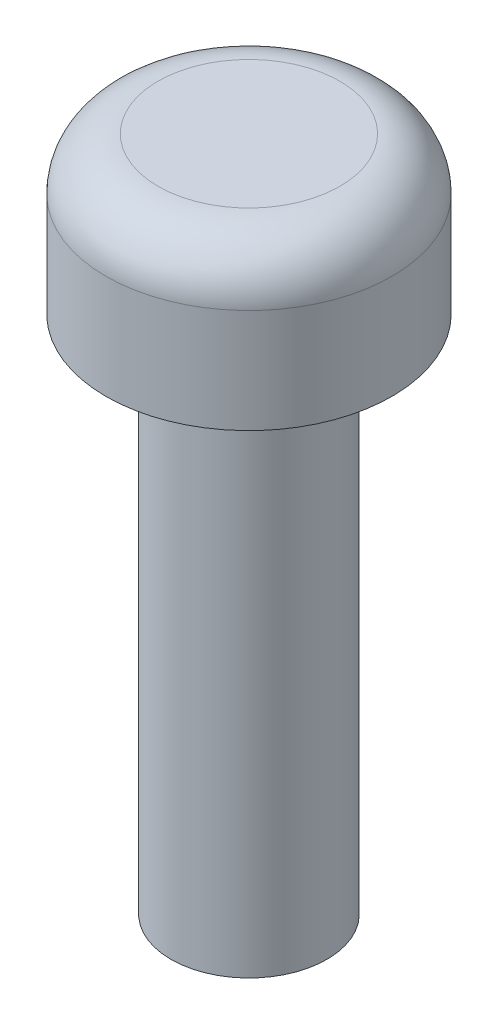
ISO-10303-21;
HEADER;
FILE_DESCRIPTION(('STEP AP214'),'2;1');
FILE_NAME('part.step','',(''),(''),'','','');
FILE_SCHEMA(('AUTOMOTIVE_DESIGN { 1 0 10303 214 1 1 1 1 }'));
ENDSEC;
DATA;
#1=APPLICATION_CONTEXT('core data for automotive mechanical design processes');
#2=APPLICATION_PROTOCOL_DEFINITION('international standard','automotive_design',2000,#1);
#3=PRODUCT_CONTEXT('',#1,'mechanical');
#4=PRODUCT('Part','Part','',(#3));
#5=PRODUCT_RELATED_PRODUCT_CATEGORY('part','',(#4));
#6=PRODUCT_DEFINITION_FORMATION('','',#4);
#7=PRODUCT_DEFINITION_CONTEXT('part definition',#1,'design');
#8=PRODUCT_DEFINITION('design','',#6,#7);
#9=PRODUCT_DEFINITION_SHAPE('','',#8);
#10=(LENGTH_UNIT() NAMED_UNIT(*) SI_UNIT(.MILLI.,.METRE.));
#11=(NAMED_UNIT(*) PLANE_ANGLE_UNIT() SI_UNIT($,.RADIAN.));
#12=(NAMED_UNIT(*) SI_UNIT($,.STERADIAN.) SOLID_ANGLE_UNIT());
#13=UNCERTAINTY_MEASURE_WITH_UNIT(LENGTH_MEASURE(1.E-05),#10,'distance_accuracy_value','');
#14=(GEOMETRIC_REPRESENTATION_CONTEXT(3) GLOBAL_UNCERTAINTY_ASSIGNED_CONTEXT((#13)) GLOBAL_UNIT_ASSIGNED_CONTEXT((#10,
#11,#12)) REPRESENTATION_CONTEXT('',''));
#15=CARTESIAN_POINT('',(0.,0.,0.));
#16=DIRECTION('',(0.,0.,1.));
#17=DIRECTION('',(1.,0.,0.));
#18=AXIS2_PLACEMENT_3D('',#15,#16,#17);
#19=CARTESIAN_POINT('',(0.,10.,0.));
#20=DIRECTION('',(0.,-1.,0.));
#21=DIRECTION('',(0.,0.,-1.));
#22=AXIS2_PLACEMENT_3D('',#19,#20,#21);
#23=CYLINDRICAL_SURFACE('',#22,1.5);
#24=CARTESIAN_POINT('',(0.,10.,0.));
#25=DIRECTION('',(0.,1.,0.));
#26=DIRECTION('',(0.,0.,1.));
#27=AXIS2_PLACEMENT_3D('',#24,#25,#26);
#28=CIRCLE('',#27,1.5);
#29=CARTESIAN_POINT('',(0.,10.,1.5));
#30=VERTEX_POINT('',#29);
#31=EDGE_CURVE('E51',#30,#30,#28,.T.);
#32=ORIENTED_EDGE('',*,*,#31,.F.);
#33=EDGE_LOOP('',(#32));
#34=FACE_BOUND('',#33,.T.);
#35=CARTESIAN_POINT('',(0.,0.,0.));
#36=DIRECTION('',(0.,1.,0.));
#37=DIRECTION('',(0.,0.,1.));
#38=AXIS2_PLACEMENT_3D('',#35,#36,#37);
#39=CIRCLE('',#38,1.5);
#40=CARTESIAN_POINT('',(0.,0.,1.5));
#41=VERTEX_POINT('',#40);
#42=EDGE_CURVE('E56',#41,#41,#39,.T.);
#43=ORIENTED_EDGE('',*,*,#42,.T.);
#44=EDGE_LOOP('',(#43));
#45=FACE_BOUND('',#44,.T.);
#46=ADVANCED_FACE('F38',(#34,#45),#23,.T.);
#47=CARTESIAN_POINT('',(0.,0.,0.));
#48=DIRECTION('',(0.,1.,0.));
#49=DIRECTION('',(0.,0.,1.));
#50=AXIS2_PLACEMENT_3D('',#47,#48,#49);
#51=PLANE('',#50);
#52=ORIENTED_EDGE('',*,*,#42,.F.);
#53=EDGE_LOOP('',(#52));
#54=FACE_BOUND('',#53,.T.);
#55=ADVANCED_FACE('F83',(#54),#51,.F.);
#56=CARTESIAN_POINT('',(0.,13.,0.));
#57=DIRECTION('',(0.,-1.,0.));
#58=DIRECTION('',(0.,0.,-1.));
#59=AXIS2_PLACEMENT_3D('',#56,#57,#58);
#60=CYLINDRICAL_SURFACE('',#59,2.75);
#61=CARTESIAN_POINT('',(0.,12.,0.));
#62=DIRECTION('',(0.,1.,0.));
#63=DIRECTION('',(0.,0.,1.));
#64=AXIS2_PLACEMENT_3D('',#61,#62,#63);
#65=CIRCLE('',#64,2.75);
#66=CARTESIAN_POINT('',(0.,12.,2.75));
#67=VERTEX_POINT('',#66);
#68=EDGE_CURVE('E10',#67,#67,#65,.F.);
#69=ORIENTED_EDGE('',*,*,#68,.T.);
#70=EDGE_LOOP('',(#69));
#71=FACE_BOUND('',#70,.T.);
#72=CARTESIAN_POINT('',(0.,10.,0.));
#73=DIRECTION('',(0.,1.,0.));
#74=DIRECTION('',(0.,0.,1.));
#75=AXIS2_PLACEMENT_3D('',#72,#73,#74);
#76=CIRCLE('',#75,2.75);
#77=CARTESIAN_POINT('',(0.,10.,2.75));
#78=VERTEX_POINT('',#77);
#79=EDGE_CURVE('E61',#78,#78,#76,.T.);
#80=ORIENTED_EDGE('',*,*,#79,.T.);
#81=EDGE_LOOP('',(#80));
#82=FACE_BOUND('',#81,.T.);
#83=ADVANCED_FACE('F67',(#71,#82),#60,.T.);
#84=CARTESIAN_POINT('',(0.,13.,0.));
#85=DIRECTION('',(0.,1.,0.));
#86=DIRECTION('',(0.,0.,1.));
#87=AXIS2_PLACEMENT_3D('',#84,#85,#86);
#88=PLANE('',#87);
#89=CARTESIAN_POINT('',(0.,13.,0.));
#90=DIRECTION('',(0.,1.,0.));
#91=DIRECTION('',(0.,0.,1.));
#92=AXIS2_PLACEMENT_3D('',#89,#90,#91);
#93=CIRCLE('',#92,1.75);
#94=CARTESIAN_POINT('',(0.,13.,1.75));
#95=VERTEX_POINT('',#94);
#96=EDGE_CURVE('E46',#95,#95,#93,.T.);
#97=ORIENTED_EDGE('',*,*,#96,.T.);
#98=EDGE_LOOP('',(#97));
#99=FACE_BOUND('',#98,.T.);
#100=ADVANCED_FACE('F71',(#99),#88,.T.);
#101=CARTESIAN_POINT('',(0.,10.,0.));
#102=DIRECTION('',(0.,1.,0.));
#103=DIRECTION('',(0.,0.,1.));
#104=AXIS2_PLACEMENT_3D('',#101,#102,#103);
#105=PLANE('',#104);
#106=ORIENTED_EDGE('',*,*,#31,.T.);
#107=EDGE_LOOP('',(#106));
#108=FACE_BOUND('',#107,.T.);
#109=ORIENTED_EDGE('',*,*,#79,.F.);
#110=EDGE_LOOP('',(#109));
#111=FACE_BOUND('',#110,.T.);
#112=ADVANCED_FACE('F69',(#108,#111),#105,.F.);
#113=CARTESIAN_POINT('',(0.,12.,0.));
#114=DIRECTION('',(0.,1.,0.));
#115=DIRECTION('',(0.,0.,1.));
#116=AXIS2_PLACEMENT_3D('',#113,#114,#115);
#117=TOROIDAL_SURFACE('',#116,1.75,1.);
#118=ORIENTED_EDGE('',*,*,#68,.F.);
#119=EDGE_LOOP('',(#118));
#120=FACE_BOUND('',#119,.T.);
#121=ORIENTED_EDGE('',*,*,#96,.F.);
#122=EDGE_LOOP('',(#121));
#123=FACE_BOUND('',#122,.T.);
#124=ADVANCED_FACE('F40',(#120,#123),#117,.T.);
#125=CLOSED_SHELL('',(#46,#55,#83,#100,#112,#124));
#126=MANIFOLD_SOLID_BREP('B2',#125);
#127=ADVANCED_BREP_SHAPE_REPRESENTATION('',(#18,#126),#14);
#128=SHAPE_DEFINITION_REPRESENTATION(#9,#127);
ENDSEC;
END-ISO-10303-21;
